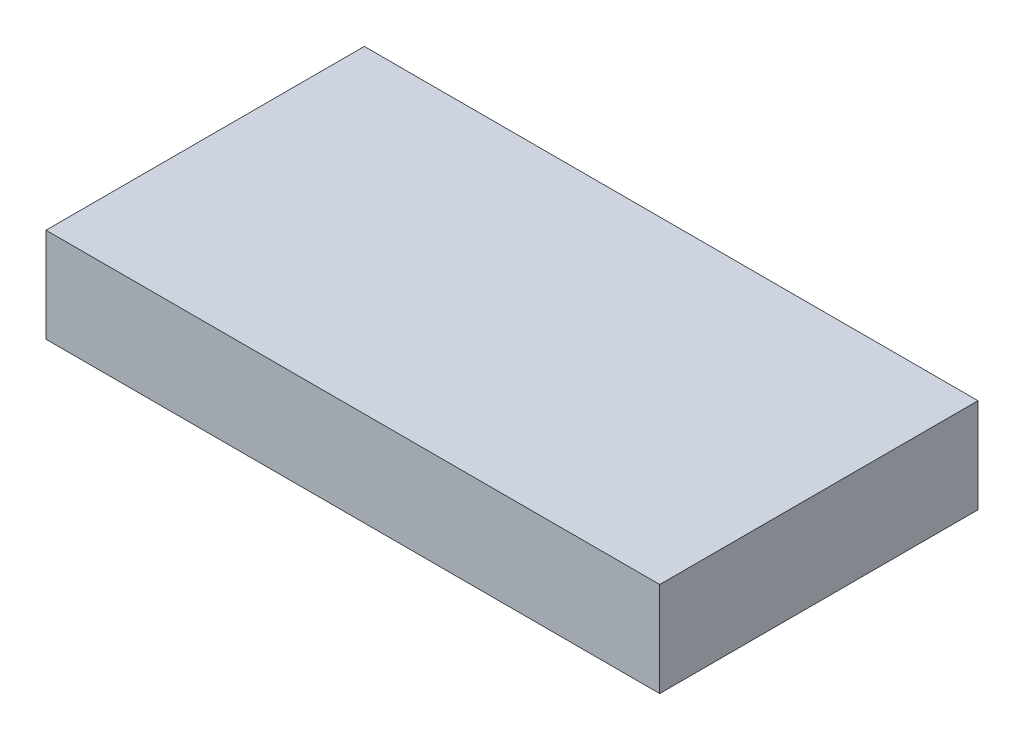
ISO-10303-21;
HEADER;
FILE_DESCRIPTION(('STEP AP214'),'2;1');
FILE_NAME('part.step','',(''),(''),'','','');
FILE_SCHEMA(('AUTOMOTIVE_DESIGN { 1 0 10303 214 1 1 1 1 }'));
ENDSEC;
DATA;
#1=APPLICATION_CONTEXT('core data for automotive mechanical design processes');
#2=APPLICATION_PROTOCOL_DEFINITION('international standard','automotive_design',2000,#1);
#3=PRODUCT_CONTEXT('',#1,'mechanical');
#4=PRODUCT('Part','Part','',(#3));
#5=PRODUCT_RELATED_PRODUCT_CATEGORY('part','',(#4));
#6=PRODUCT_DEFINITION_FORMATION('','',#4);
#7=PRODUCT_DEFINITION_CONTEXT('part definition',#1,'design');
#8=PRODUCT_DEFINITION('design','',#6,#7);
#9=PRODUCT_DEFINITION_SHAPE('','',#8);
#10=(LENGTH_UNIT() NAMED_UNIT(*) SI_UNIT(.MILLI.,.METRE.));
#11=(NAMED_UNIT(*) PLANE_ANGLE_UNIT() SI_UNIT($,.RADIAN.));
#12=(NAMED_UNIT(*) SI_UNIT($,.STERADIAN.) SOLID_ANGLE_UNIT());
#13=UNCERTAINTY_MEASURE_WITH_UNIT(LENGTH_MEASURE(1.E-05),#10,'distance_accuracy_value','');
#14=(GEOMETRIC_REPRESENTATION_CONTEXT(3) GLOBAL_UNCERTAINTY_ASSIGNED_CONTEXT((#13)) GLOBAL_UNIT_ASSIGNED_CONTEXT((#10,
#11,#12)) REPRESENTATION_CONTEXT('',''));
#15=CARTESIAN_POINT('',(0.,0.,0.));
#16=DIRECTION('',(0.,0.,1.));
#17=DIRECTION('',(1.,0.,0.));
#18=AXIS2_PLACEMENT_3D('',#15,#16,#17);
#19=CARTESIAN_POINT('',(0.,10.,0.));
#20=DIRECTION('',(1.,0.,0.));
#21=DIRECTION('',(0.,0.,-1.));
#22=AXIS2_PLACEMENT_3D('',#19,#20,#21);
#23=PLANE('',#22);
#24=DIRECTION('',(0.,0.,1.));
#25=VECTOR('',#24,1.);
#26=CARTESIAN_POINT('',(0.,0.,0.));
#27=LINE('',#26,#25);
#28=CARTESIAN_POINT('',(0.,0.,-33.6890419212852));
#29=VERTEX_POINT('',#28);
#30=CARTESIAN_POINT('',(0.,0.,0.));
#31=VERTEX_POINT('',#30);
#32=EDGE_CURVE('E113',#29,#31,#27,.T.);
#33=ORIENTED_EDGE('',*,*,#32,.T.);
#34=DIRECTION('',(0.,-1.,0.));
#35=VECTOR('',#34,1.);
#36=CARTESIAN_POINT('',(0.,10.,0.));
#37=LINE('',#36,#35);
#38=CARTESIAN_POINT('',(0.,10.,0.));
#39=VERTEX_POINT('',#38);
#40=EDGE_CURVE('E11',#39,#31,#37,.T.);
#41=ORIENTED_EDGE('',*,*,#40,.F.);
#42=DIRECTION('',(0.,0.,1.));
#43=VECTOR('',#42,1.);
#44=CARTESIAN_POINT('',(0.,10.,0.));
#45=LINE('',#44,#43);
#46=CARTESIAN_POINT('',(0.,10.,-33.6890419212852));
#47=VERTEX_POINT('',#46);
#48=EDGE_CURVE('E97',#47,#39,#45,.T.);
#49=ORIENTED_EDGE('',*,*,#48,.F.);
#50=DIRECTION('',(0.,-1.,0.));
#51=VECTOR('',#50,1.);
#52=CARTESIAN_POINT('',(0.,10.,-33.6890419212852));
#53=LINE('',#52,#51);
#54=EDGE_CURVE('E109',#47,#29,#53,.T.);
#55=ORIENTED_EDGE('',*,*,#54,.T.);
#56=EDGE_LOOP('',(#33,#41,#49,#55));
#57=FACE_BOUND('',#56,.T.);
#58=ADVANCED_FACE('F45',(#57),#23,.F.);
#59=CARTESIAN_POINT('',(0.,10.,0.));
#60=DIRECTION('',(0.,0.,-1.));
#61=DIRECTION('',(-1.,0.,0.));
#62=AXIS2_PLACEMENT_3D('',#59,#60,#61);
#63=PLANE('',#62);
#64=DIRECTION('',(1.,0.,0.));
#65=VECTOR('',#64,1.);
#66=CARTESIAN_POINT('',(0.,0.,0.));
#67=LINE('',#66,#65);
#68=CARTESIAN_POINT('',(64.9517262526718,0.,0.));
#69=VERTEX_POINT('',#68);
#70=EDGE_CURVE('E102',#31,#69,#67,.T.);
#71=ORIENTED_EDGE('',*,*,#70,.T.);
#72=DIRECTION('',(0.,-1.,0.));
#73=VECTOR('',#72,1.);
#74=CARTESIAN_POINT('',(64.9517262526718,10.,0.));
#75=LINE('',#74,#73);
#76=CARTESIAN_POINT('',(64.9517262526718,10.,0.));
#77=VERTEX_POINT('',#76);
#78=EDGE_CURVE('E54',#77,#69,#75,.T.);
#79=ORIENTED_EDGE('',*,*,#78,.F.);
#80=DIRECTION('',(1.,0.,0.));
#81=VECTOR('',#80,1.);
#82=CARTESIAN_POINT('',(0.,10.,0.));
#83=LINE('',#82,#81);
#84=EDGE_CURVE('E92',#39,#77,#83,.T.);
#85=ORIENTED_EDGE('',*,*,#84,.F.);
#86=ORIENTED_EDGE('',*,*,#40,.T.);
#87=EDGE_LOOP('',(#71,#79,#85,#86));
#88=FACE_BOUND('',#87,.T.);
#89=ADVANCED_FACE('F101',(#88),#63,.F.);
#90=CARTESIAN_POINT('',(64.9517262526718,10.,0.));
#91=DIRECTION('',(-1.,0.,0.));
#92=DIRECTION('',(0.,0.,1.));
#93=AXIS2_PLACEMENT_3D('',#90,#91,#92);
#94=PLANE('',#93);
#95=DIRECTION('',(0.,0.,-1.));
#96=VECTOR('',#95,1.);
#97=CARTESIAN_POINT('',(64.9517262526718,0.,0.));
#98=LINE('',#97,#96);
#99=CARTESIAN_POINT('',(64.9517262526718,0.,-33.6890419212852));
#100=VERTEX_POINT('',#99);
#101=EDGE_CURVE('E79',#69,#100,#98,.T.);
#102=ORIENTED_EDGE('',*,*,#101,.T.);
#103=DIRECTION('',(0.,-1.,0.));
#104=VECTOR('',#103,1.);
#105=CARTESIAN_POINT('',(64.9517262526718,10.,-33.6890419212852));
#106=LINE('',#105,#104);
#107=CARTESIAN_POINT('',(64.9517262526718,10.,-33.6890419212852));
#108=VERTEX_POINT('',#107);
#109=EDGE_CURVE('E104',#108,#100,#106,.T.);
#110=ORIENTED_EDGE('',*,*,#109,.F.);
#111=DIRECTION('',(0.,0.,-1.));
#112=VECTOR('',#111,1.);
#113=CARTESIAN_POINT('',(64.9517262526718,10.,0.));
#114=LINE('',#113,#112);
#115=EDGE_CURVE('E95',#77,#108,#114,.T.);
#116=ORIENTED_EDGE('',*,*,#115,.F.);
#117=ORIENTED_EDGE('',*,*,#78,.T.);
#118=EDGE_LOOP('',(#102,#110,#116,#117));
#119=FACE_BOUND('',#118,.T.);
#120=ADVANCED_FACE('F105',(#119),#94,.F.);
#121=CARTESIAN_POINT('',(0.,10.,-33.6890419212852));
#122=DIRECTION('',(0.,0.,1.));
#123=DIRECTION('',(1.,0.,0.));
#124=AXIS2_PLACEMENT_3D('',#121,#122,#123);
#125=PLANE('',#124);
#126=DIRECTION('',(-1.,0.,0.));
#127=VECTOR('',#126,1.);
#128=CARTESIAN_POINT('',(0.,0.,-33.6890419212852));
#129=LINE('',#128,#127);
#130=EDGE_CURVE('E85',#100,#29,#129,.T.);
#131=ORIENTED_EDGE('',*,*,#130,.T.);
#132=ORIENTED_EDGE('',*,*,#54,.F.);
#133=DIRECTION('',(-1.,0.,0.));
#134=VECTOR('',#133,1.);
#135=CARTESIAN_POINT('',(0.,10.,-33.6890419212852));
#136=LINE('',#135,#134);
#137=EDGE_CURVE('E62',#108,#47,#136,.T.);
#138=ORIENTED_EDGE('',*,*,#137,.F.);
#139=ORIENTED_EDGE('',*,*,#109,.T.);
#140=EDGE_LOOP('',(#131,#132,#138,#139));
#141=FACE_BOUND('',#140,.T.);
#142=ADVANCED_FACE('F126',(#141),#125,.F.);
#143=CARTESIAN_POINT('',(0.,10.,0.));
#144=DIRECTION('',(0.,-1.,0.));
#145=DIRECTION('',(0.,0.,-1.));
#146=AXIS2_PLACEMENT_3D('',#143,#144,#145);
#147=PLANE('',#146);
#148=ORIENTED_EDGE('',*,*,#48,.T.);
#149=ORIENTED_EDGE('',*,*,#84,.T.);
#150=ORIENTED_EDGE('',*,*,#115,.T.);
#151=ORIENTED_EDGE('',*,*,#137,.T.);
#152=EDGE_LOOP('',(#148,#149,#150,#151));
#153=FACE_BOUND('',#152,.T.);
#154=ADVANCED_FACE('F93',(#153),#147,.F.);
#155=CARTESIAN_POINT('',(0.,0.,0.));
#156=DIRECTION('',(0.,-1.,0.));
#157=DIRECTION('',(0.,0.,-1.));
#158=AXIS2_PLACEMENT_3D('',#155,#156,#157);
#159=PLANE('',#158);
#160=ORIENTED_EDGE('',*,*,#32,.F.);
#161=ORIENTED_EDGE('',*,*,#130,.F.);
#162=ORIENTED_EDGE('',*,*,#101,.F.);
#163=ORIENTED_EDGE('',*,*,#70,.F.);
#164=EDGE_LOOP('',(#160,#161,#162,#163));
#165=FACE_BOUND('',#164,.T.);
#166=ADVANCED_FACE('F129',(#165),#159,.T.);
#167=CLOSED_SHELL('',(#58,#89,#120,#142,#154,#166));
#168=MANIFOLD_SOLID_BREP('B2',#167);
#169=ADVANCED_BREP_SHAPE_REPRESENTATION('',(#18,#168),#14);
#170=SHAPE_DEFINITION_REPRESENTATION(#9,#169);
ENDSEC;
END-ISO-10303-21;
